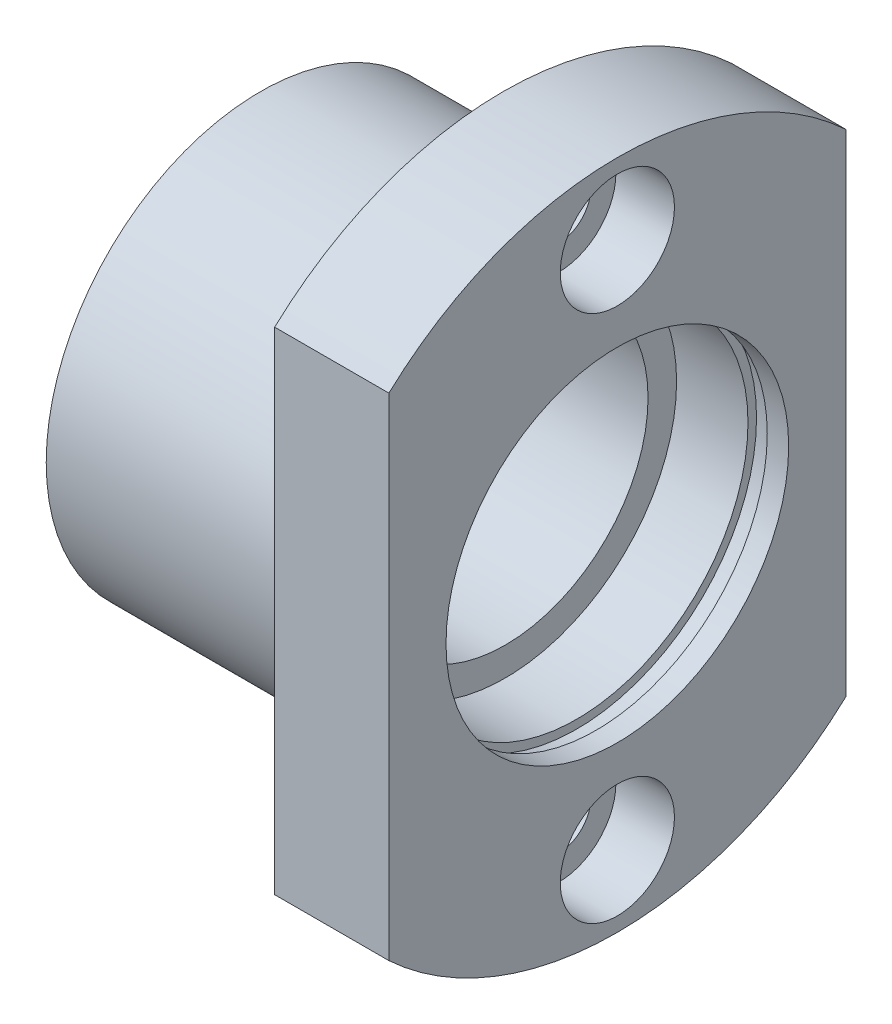
ISO-10303-21;
HEADER;
FILE_DESCRIPTION(('STEP AP214'),'2;1');
FILE_NAME('part.step','',(''),(''),'','','');
FILE_SCHEMA(('AUTOMOTIVE_DESIGN { 1 0 10303 214 1 1 1 1 }'));
ENDSEC;
DATA;
#1=APPLICATION_CONTEXT('core data for automotive mechanical design processes');
#2=APPLICATION_PROTOCOL_DEFINITION('international standard','automotive_design',2000,#1);
#3=PRODUCT_CONTEXT('',#1,'mechanical');
#4=PRODUCT('Part','Part','',(#3));
#5=PRODUCT_RELATED_PRODUCT_CATEGORY('part','',(#4));
#6=PRODUCT_DEFINITION_FORMATION('','',#4);
#7=PRODUCT_DEFINITION_CONTEXT('part definition',#1,'design');
#8=PRODUCT_DEFINITION('design','',#6,#7);
#9=PRODUCT_DEFINITION_SHAPE('','',#8);
#10=(LENGTH_UNIT() NAMED_UNIT(*) SI_UNIT(.MILLI.,.METRE.));
#11=(NAMED_UNIT(*) PLANE_ANGLE_UNIT() SI_UNIT($,.RADIAN.));
#12=(NAMED_UNIT(*) SI_UNIT($,.STERADIAN.) SOLID_ANGLE_UNIT());
#13=UNCERTAINTY_MEASURE_WITH_UNIT(LENGTH_MEASURE(1.E-05),#10,'distance_accuracy_value','');
#14=(GEOMETRIC_REPRESENTATION_CONTEXT(3) GLOBAL_UNCERTAINTY_ASSIGNED_CONTEXT((#13)) GLOBAL_UNIT_ASSIGNED_CONTEXT((#10,
#11,#12)) REPRESENTATION_CONTEXT('',''));
#15=CARTESIAN_POINT('',(0.,0.,0.));
#16=DIRECTION('',(0.,0.,1.));
#17=DIRECTION('',(1.,0.,0.));
#18=AXIS2_PLACEMENT_3D('',#15,#16,#17);
#19=CARTESIAN_POINT('',(17.,23.5,0.));
#20=DIRECTION('',(-1.,0.,0.));
#21=DIRECTION('',(0.,0.,1.));
#22=AXIS2_PLACEMENT_3D('',#19,#20,#21);
#23=PLANE('',#22);
#24=CARTESIAN_POINT('',(17.,18.5,0.));
#25=DIRECTION('',(-1.,0.,0.));
#26=DIRECTION('',(0.,0.,1.));
#27=AXIS2_PLACEMENT_3D('',#24,#25,#26);
#28=CIRCLE('',#27,2.25);
#29=CARTESIAN_POINT('',(17.,18.5,2.25));
#30=VERTEX_POINT('',#29);
#31=EDGE_CURVE('E37',#30,#30,#28,.T.);
#32=ORIENTED_EDGE('',*,*,#31,.F.);
#33=EDGE_LOOP('',(#32));
#34=FACE_BOUND('',#33,.T.);
#35=CARTESIAN_POINT('',(17.,-18.5,0.));
#36=DIRECTION('',(-1.,0.,0.));
#37=DIRECTION('',(0.,0.,1.));
#38=AXIS2_PLACEMENT_3D('',#35,#36,#37);
#39=CIRCLE('',#38,2.25);
#40=CARTESIAN_POINT('',(17.,-18.5,2.25));
#41=VERTEX_POINT('',#40);
#42=EDGE_CURVE('E109',#41,#41,#39,.T.);
#43=ORIENTED_EDGE('',*,*,#42,.F.);
#44=EDGE_LOOP('',(#43));
#45=FACE_BOUND('',#44,.T.);
#46=CARTESIAN_POINT('',(17.,0.,0.));
#47=DIRECTION('',(1.,0.,0.));
#48=DIRECTION('',(0.,0.,-1.));
#49=AXIS2_PLACEMENT_3D('',#46,#47,#48);
#50=CIRCLE('',#49,15.);
#51=CARTESIAN_POINT('',(17.,0.,-15.));
#52=VERTEX_POINT('',#51);
#53=EDGE_CURVE('E102',#52,#52,#50,.T.);
#54=ORIENTED_EDGE('',*,*,#53,.T.);
#55=EDGE_LOOP('',(#54));
#56=FACE_BOUND('',#55,.T.);
#57=CARTESIAN_POINT('',(17.,0.,0.));
#58=DIRECTION('',(1.,0.,0.));
#59=DIRECTION('',(0.,0.,-1.));
#60=AXIS2_PLACEMENT_3D('',#57,#58,#59);
#61=CIRCLE('',#60,23.5);
#62=CARTESIAN_POINT('',(17.,17.2119144780585,-16.));
#63=VERTEX_POINT('',#62);
#64=CARTESIAN_POINT('',(17.,17.2119144780585,16.));
#65=VERTEX_POINT('',#64);
#66=EDGE_CURVE('E94',#63,#65,#61,.T.);
#67=ORIENTED_EDGE('',*,*,#66,.F.);
#68=DIRECTION('',(0.,-1.,0.));
#69=VECTOR('',#68,1.);
#70=CARTESIAN_POINT('',(17.,17.2119144780585,-16.));
#71=LINE('',#70,#69);
#72=CARTESIAN_POINT('',(17.,-17.2119144780585,-16.));
#73=VERTEX_POINT('',#72);
#74=EDGE_CURVE('E82',#63,#73,#71,.T.);
#75=ORIENTED_EDGE('',*,*,#74,.T.);
#76=CARTESIAN_POINT('',(17.,-17.2119144780585,16.));
#77=VERTEX_POINT('',#76);
#78=EDGE_CURVE('E90',#77,#73,#61,.T.);
#79=ORIENTED_EDGE('',*,*,#78,.F.);
#80=DIRECTION('',(0.,1.,0.));
#81=VECTOR('',#80,1.);
#82=CARTESIAN_POINT('',(17.,17.2119144780585,16.));
#83=LINE('',#82,#81);
#84=EDGE_CURVE('E126',#77,#65,#83,.T.);
#85=ORIENTED_EDGE('',*,*,#84,.T.);
#86=EDGE_LOOP('',(#67,#75,#79,#85));
#87=FACE_BOUND('',#86,.T.);
#88=ADVANCED_FACE('F33',(#34,#45,#56,#87),#23,.T.);
#89=CARTESIAN_POINT('',(25.,0.,0.));
#90=DIRECTION('',(1.,0.,0.));
#91=DIRECTION('',(0.,0.,-1.));
#92=AXIS2_PLACEMENT_3D('',#89,#90,#91);
#93=CYLINDRICAL_SURFACE('',#92,23.5);
#94=CARTESIAN_POINT('',(25.,0.,0.));
#95=DIRECTION('',(1.,0.,0.));
#96=DIRECTION('',(0.,0.,-1.));
#97=AXIS2_PLACEMENT_3D('',#94,#95,#96);
#98=CIRCLE('',#97,23.5);
#99=CARTESIAN_POINT('',(25.,17.2119144780585,-16.));
#100=VERTEX_POINT('',#99);
#101=CARTESIAN_POINT('',(25.,17.2119144780585,16.));
#102=VERTEX_POINT('',#101);
#103=EDGE_CURVE('E95',#100,#102,#98,.T.);
#104=ORIENTED_EDGE('',*,*,#103,.F.);
#105=DIRECTION('',(-1.,0.,0.));
#106=VECTOR('',#105,1.);
#107=CARTESIAN_POINT('',(25.,17.2119144780585,-16.));
#108=LINE('',#107,#106);
#109=EDGE_CURVE('E50',#100,#63,#108,.T.);
#110=ORIENTED_EDGE('',*,*,#109,.T.);
#111=ORIENTED_EDGE('',*,*,#66,.T.);
#112=DIRECTION('',(-1.,0.,0.));
#113=VECTOR('',#112,1.);
#114=CARTESIAN_POINT('',(25.,17.2119144780585,16.));
#115=LINE('',#114,#113);
#116=EDGE_CURVE('E128',#102,#65,#115,.T.);
#117=ORIENTED_EDGE('',*,*,#116,.F.);
#118=EDGE_LOOP('',(#104,#110,#111,#117));
#119=FACE_BOUND('',#118,.T.);
#120=ADVANCED_FACE('F182',(#119),#93,.T.);
#121=ORIENTED_EDGE('',*,*,#78,.T.);
#122=DIRECTION('',(-1.,0.,0.));
#123=VECTOR('',#122,1.);
#124=CARTESIAN_POINT('',(25.,-17.2119144780585,-16.));
#125=LINE('',#124,#123);
#126=CARTESIAN_POINT('',(25.,-17.2119144780585,-16.));
#127=VERTEX_POINT('',#126);
#128=EDGE_CURVE('E77',#127,#73,#125,.T.);
#129=ORIENTED_EDGE('',*,*,#128,.F.);
#130=CARTESIAN_POINT('',(25.,-17.2119144780585,16.));
#131=VERTEX_POINT('',#130);
#132=EDGE_CURVE('E88',#131,#127,#98,.T.);
#133=ORIENTED_EDGE('',*,*,#132,.F.);
#134=DIRECTION('',(-1.,0.,0.));
#135=VECTOR('',#134,1.);
#136=CARTESIAN_POINT('',(25.,-17.2119144780585,16.));
#137=LINE('',#136,#135);
#138=EDGE_CURVE('E58',#131,#77,#137,.T.);
#139=ORIENTED_EDGE('',*,*,#138,.T.);
#140=EDGE_LOOP('',(#121,#129,#133,#139));
#141=FACE_BOUND('',#140,.T.);
#142=ADVANCED_FACE('F87',(#141),#93,.T.);
#143=CARTESIAN_POINT('',(25.,12.,0.));
#144=DIRECTION('',(1.,0.,0.));
#145=DIRECTION('',(0.,0.,-1.));
#146=AXIS2_PLACEMENT_3D('',#143,#144,#145);
#147=PLANE('',#146);
#148=CARTESIAN_POINT('',(25.,18.5,0.));
#149=DIRECTION('',(1.,0.,0.));
#150=DIRECTION('',(0.,0.,-1.));
#151=AXIS2_PLACEMENT_3D('',#148,#149,#150);
#152=CIRCLE('',#151,4.);
#153=CARTESIAN_POINT('',(25.,18.5,-4.));
#154=VERTEX_POINT('',#153);
#155=EDGE_CURVE('E408',#154,#154,#152,.T.);
#156=ORIENTED_EDGE('',*,*,#155,.F.);
#157=EDGE_LOOP('',(#156));
#158=FACE_BOUND('',#157,.T.);
#159=CARTESIAN_POINT('',(25.,-18.5,0.));
#160=DIRECTION('',(1.,0.,0.));
#161=DIRECTION('',(0.,0.,-1.));
#162=AXIS2_PLACEMENT_3D('',#159,#160,#161);
#163=CIRCLE('',#162,4.);
#164=CARTESIAN_POINT('',(25.,-18.5,-4.));
#165=VERTEX_POINT('',#164);
#166=EDGE_CURVE('E121',#165,#165,#163,.T.);
#167=ORIENTED_EDGE('',*,*,#166,.F.);
#168=EDGE_LOOP('',(#167));
#169=FACE_BOUND('',#168,.T.);
#170=CARTESIAN_POINT('',(25.,0.,0.));
#171=DIRECTION('',(1.,0.,0.));
#172=DIRECTION('',(0.,0.,-1.));
#173=AXIS2_PLACEMENT_3D('',#170,#171,#172);
#174=CIRCLE('',#173,12.);
#175=CARTESIAN_POINT('',(25.,0.,-12.));
#176=VERTEX_POINT('',#175);
#177=EDGE_CURVE('E98',#176,#176,#174,.T.);
#178=ORIENTED_EDGE('',*,*,#177,.F.);
#179=EDGE_LOOP('',(#178));
#180=FACE_BOUND('',#179,.T.);
#181=ORIENTED_EDGE('',*,*,#132,.T.);
#182=DIRECTION('',(0.,-1.,0.));
#183=VECTOR('',#182,1.);
#184=CARTESIAN_POINT('',(25.,17.2119144780585,-16.));
#185=LINE('',#184,#183);
#186=EDGE_CURVE('E74',#100,#127,#185,.T.);
#187=ORIENTED_EDGE('',*,*,#186,.F.);
#188=ORIENTED_EDGE('',*,*,#103,.T.);
#189=DIRECTION('',(0.,1.,0.));
#190=VECTOR('',#189,1.);
#191=CARTESIAN_POINT('',(25.,17.2119144780585,16.));
#192=LINE('',#191,#190);
#193=EDGE_CURVE('E93',#131,#102,#192,.T.);
#194=ORIENTED_EDGE('',*,*,#193,.F.);
#195=EDGE_LOOP('',(#181,#187,#188,#194));
#196=FACE_BOUND('',#195,.T.);
#197=ADVANCED_FACE('F92',(#158,#169,#180,#196),#147,.T.);
#198=CARTESIAN_POINT('',(1.5,12.,0.));
#199=DIRECTION('',(1.,0.,0.));
#200=DIRECTION('',(0.,0.,-1.));
#201=AXIS2_PLACEMENT_3D('',#198,#199,#200);
#202=PLANE('',#201);
#203=CARTESIAN_POINT('',(1.5,0.,0.));
#204=DIRECTION('',(1.,0.,0.));
#205=DIRECTION('',(0.,0.,-1.));
#206=AXIS2_PLACEMENT_3D('',#203,#204,#205);
#207=CIRCLE('',#206,12.6);
#208=CARTESIAN_POINT('',(1.5,0.,-12.6));
#209=VERTEX_POINT('',#208);
#210=EDGE_CURVE('E134',#209,#209,#207,.T.);
#211=ORIENTED_EDGE('',*,*,#210,.T.);
#212=EDGE_LOOP('',(#211));
#213=FACE_BOUND('',#212,.T.);
#214=CARTESIAN_POINT('',(1.5,0.,0.));
#215=DIRECTION('',(1.,0.,0.));
#216=DIRECTION('',(0.,0.,-1.));
#217=AXIS2_PLACEMENT_3D('',#214,#215,#216);
#218=CIRCLE('',#217,12.);
#219=CARTESIAN_POINT('',(1.5,0.,-12.));
#220=VERTEX_POINT('',#219);
#221=EDGE_CURVE('E11',#220,#220,#218,.T.);
#222=ORIENTED_EDGE('',*,*,#221,.F.);
#223=EDGE_LOOP('',(#222));
#224=FACE_BOUND('',#223,.T.);
#225=ADVANCED_FACE('F35',(#213,#224),#202,.T.);
#226=CARTESIAN_POINT('',(25.,0.,0.));
#227=DIRECTION('',(1.,0.,0.));
#228=DIRECTION('',(0.,0.,-1.));
#229=AXIS2_PLACEMENT_3D('',#226,#227,#228);
#230=CYLINDRICAL_SURFACE('',#229,12.);
#231=ORIENTED_EDGE('',*,*,#221,.T.);
#232=EDGE_LOOP('',(#231));
#233=FACE_BOUND('',#232,.T.);
#234=CARTESIAN_POINT('',(0.,0.,0.));
#235=DIRECTION('',(1.,0.,0.));
#236=DIRECTION('',(0.,0.,-1.));
#237=AXIS2_PLACEMENT_3D('',#234,#235,#236);
#238=CIRCLE('',#237,12.);
#239=CARTESIAN_POINT('',(0.,0.,-12.));
#240=VERTEX_POINT('',#239);
#241=EDGE_CURVE('E42',#240,#240,#238,.T.);
#242=ORIENTED_EDGE('',*,*,#241,.F.);
#243=EDGE_LOOP('',(#242));
#244=FACE_BOUND('',#243,.T.);
#245=ADVANCED_FACE('F180',(#233,#244),#230,.F.);
#246=CARTESIAN_POINT('',(0.,15.,0.));
#247=DIRECTION('',(-1.,0.,0.));
#248=DIRECTION('',(0.,0.,1.));
#249=AXIS2_PLACEMENT_3D('',#246,#247,#248);
#250=PLANE('',#249);
#251=ORIENTED_EDGE('',*,*,#241,.T.);
#252=EDGE_LOOP('',(#251));
#253=FACE_BOUND('',#252,.T.);
#254=CARTESIAN_POINT('',(0.,0.,0.));
#255=DIRECTION('',(1.,0.,0.));
#256=DIRECTION('',(0.,0.,-1.));
#257=AXIS2_PLACEMENT_3D('',#254,#255,#256);
#258=CIRCLE('',#257,15.);
#259=CARTESIAN_POINT('',(0.,0.,-15.));
#260=VERTEX_POINT('',#259);
#261=EDGE_CURVE('E105',#260,#260,#258,.T.);
#262=ORIENTED_EDGE('',*,*,#261,.F.);
#263=EDGE_LOOP('',(#262));
#264=FACE_BOUND('',#263,.T.);
#265=ADVANCED_FACE('F200',(#253,#264),#250,.T.);
#266=CARTESIAN_POINT('',(25.,0.,0.));
#267=DIRECTION('',(1.,0.,0.));
#268=DIRECTION('',(0.,0.,-1.));
#269=AXIS2_PLACEMENT_3D('',#266,#267,#268);
#270=CYLINDRICAL_SURFACE('',#269,15.);
#271=ORIENTED_EDGE('',*,*,#261,.T.);
#272=EDGE_LOOP('',(#271));
#273=FACE_BOUND('',#272,.T.);
#274=ORIENTED_EDGE('',*,*,#53,.F.);
#275=EDGE_LOOP('',(#274));
#276=FACE_BOUND('',#275,.T.);
#277=ADVANCED_FACE('F197',(#273,#276),#270,.T.);
#278=CARTESIAN_POINT('',(25.,0.,0.));
#279=DIRECTION('',(1.,0.,0.));
#280=DIRECTION('',(0.,0.,-1.));
#281=AXIS2_PLACEMENT_3D('',#278,#279,#280);
#282=CYLINDRICAL_SURFACE('',#281,12.);
#283=ORIENTED_EDGE('',*,*,#177,.T.);
#284=EDGE_LOOP('',(#283));
#285=FACE_BOUND('',#284,.T.);
#286=CARTESIAN_POINT('',(23.5,0.,0.));
#287=DIRECTION('',(1.,0.,0.));
#288=DIRECTION('',(0.,0.,-1.));
#289=AXIS2_PLACEMENT_3D('',#286,#287,#288);
#290=CIRCLE('',#289,12.);
#291=CARTESIAN_POINT('',(23.5,0.,-12.));
#292=VERTEX_POINT('',#291);
#293=EDGE_CURVE('E163',#292,#292,#290,.T.);
#294=ORIENTED_EDGE('',*,*,#293,.F.);
#295=EDGE_LOOP('',(#294));
#296=FACE_BOUND('',#295,.T.);
#297=ADVANCED_FACE('F170',(#285,#296),#282,.F.);
#298=CARTESIAN_POINT('',(23.5,12.6,0.));
#299=DIRECTION('',(-1.,0.,0.));
#300=DIRECTION('',(0.,0.,1.));
#301=AXIS2_PLACEMENT_3D('',#298,#299,#300);
#302=PLANE('',#301);
#303=ORIENTED_EDGE('',*,*,#293,.T.);
#304=EDGE_LOOP('',(#303));
#305=FACE_BOUND('',#304,.T.);
#306=CARTESIAN_POINT('',(23.5,0.,0.));
#307=DIRECTION('',(1.,0.,0.));
#308=DIRECTION('',(0.,0.,-1.));
#309=AXIS2_PLACEMENT_3D('',#306,#307,#308);
#310=CIRCLE('',#309,12.6);
#311=CARTESIAN_POINT('',(23.5,0.,-12.6));
#312=VERTEX_POINT('',#311);
#313=EDGE_CURVE('E161',#312,#312,#310,.T.);
#314=ORIENTED_EDGE('',*,*,#313,.F.);
#315=EDGE_LOOP('',(#314));
#316=FACE_BOUND('',#315,.T.);
#317=ADVANCED_FACE('F264',(#305,#316),#302,.T.);
#318=CARTESIAN_POINT('',(25.,0.,0.));
#319=DIRECTION('',(1.,0.,0.));
#320=DIRECTION('',(0.,0.,-1.));
#321=AXIS2_PLACEMENT_3D('',#318,#319,#320);
#322=CYLINDRICAL_SURFACE('',#321,12.6);
#323=ORIENTED_EDGE('',*,*,#313,.T.);
#324=EDGE_LOOP('',(#323));
#325=FACE_BOUND('',#324,.T.);
#326=CARTESIAN_POINT('',(22.15,0.,0.));
#327=DIRECTION('',(1.,0.,0.));
#328=DIRECTION('',(0.,0.,-1.));
#329=AXIS2_PLACEMENT_3D('',#326,#327,#328);
#330=CIRCLE('',#329,12.6);
#331=CARTESIAN_POINT('',(22.15,0.,-12.6));
#332=VERTEX_POINT('',#331);
#333=EDGE_CURVE('E158',#332,#332,#330,.T.);
#334=ORIENTED_EDGE('',*,*,#333,.F.);
#335=EDGE_LOOP('',(#334));
#336=FACE_BOUND('',#335,.T.);
#337=ADVANCED_FACE('F260',(#325,#336),#322,.F.);
#338=CARTESIAN_POINT('',(22.15,12.,0.));
#339=DIRECTION('',(1.,0.,0.));
#340=DIRECTION('',(0.,0.,-1.));
#341=AXIS2_PLACEMENT_3D('',#338,#339,#340);
#342=PLANE('',#341);
#343=ORIENTED_EDGE('',*,*,#333,.T.);
#344=EDGE_LOOP('',(#343));
#345=FACE_BOUND('',#344,.T.);
#346=CARTESIAN_POINT('',(22.15,0.,0.));
#347=DIRECTION('',(1.,0.,0.));
#348=DIRECTION('',(0.,0.,-1.));
#349=AXIS2_PLACEMENT_3D('',#346,#347,#348);
#350=CIRCLE('',#349,12.);
#351=CARTESIAN_POINT('',(22.15,0.,-12.));
#352=VERTEX_POINT('',#351);
#353=EDGE_CURVE('E155',#352,#352,#350,.T.);
#354=ORIENTED_EDGE('',*,*,#353,.F.);
#355=EDGE_LOOP('',(#354));
#356=FACE_BOUND('',#355,.T.);
#357=ADVANCED_FACE('F256',(#345,#356),#342,.T.);
#358=CARTESIAN_POINT('',(25.,0.,0.));
#359=DIRECTION('',(1.,0.,0.));
#360=DIRECTION('',(0.,0.,-1.));
#361=AXIS2_PLACEMENT_3D('',#358,#359,#360);
#362=CYLINDRICAL_SURFACE('',#361,12.);
#363=ORIENTED_EDGE('',*,*,#353,.T.);
#364=EDGE_LOOP('',(#363));
#365=FACE_BOUND('',#364,.T.);
#366=CARTESIAN_POINT('',(17.15,0.,0.));
#367=DIRECTION('',(1.,0.,0.));
#368=DIRECTION('',(0.,0.,-1.));
#369=AXIS2_PLACEMENT_3D('',#366,#367,#368);
#370=CIRCLE('',#369,12.);
#371=CARTESIAN_POINT('',(17.15,0.,-12.));
#372=VERTEX_POINT('',#371);
#373=EDGE_CURVE('E152',#372,#372,#370,.T.);
#374=ORIENTED_EDGE('',*,*,#373,.F.);
#375=EDGE_LOOP('',(#374));
#376=FACE_BOUND('',#375,.T.);
#377=ADVANCED_FACE('F252',(#365,#376),#362,.F.);
#378=CARTESIAN_POINT('',(17.15,10.,0.));
#379=DIRECTION('',(1.,0.,0.));
#380=DIRECTION('',(0.,0.,-1.));
#381=AXIS2_PLACEMENT_3D('',#378,#379,#380);
#382=PLANE('',#381);
#383=ORIENTED_EDGE('',*,*,#373,.T.);
#384=EDGE_LOOP('',(#383));
#385=FACE_BOUND('',#384,.T.);
#386=CARTESIAN_POINT('',(17.15,0.,0.));
#387=DIRECTION('',(1.,0.,0.));
#388=DIRECTION('',(0.,0.,-1.));
#389=AXIS2_PLACEMENT_3D('',#386,#387,#388);
#390=CIRCLE('',#389,10.);
#391=CARTESIAN_POINT('',(17.15,0.,-10.));
#392=VERTEX_POINT('',#391);
#393=EDGE_CURVE('E149',#392,#392,#390,.T.);
#394=ORIENTED_EDGE('',*,*,#393,.F.);
#395=EDGE_LOOP('',(#394));
#396=FACE_BOUND('',#395,.T.);
#397=ADVANCED_FACE('F248',(#385,#396),#382,.T.);
#398=CARTESIAN_POINT('',(25.,0.,0.));
#399=DIRECTION('',(1.,0.,0.));
#400=DIRECTION('',(0.,0.,-1.));
#401=AXIS2_PLACEMENT_3D('',#398,#399,#400);
#402=CYLINDRICAL_SURFACE('',#401,10.);
#403=ORIENTED_EDGE('',*,*,#393,.T.);
#404=EDGE_LOOP('',(#403));
#405=FACE_BOUND('',#404,.T.);
#406=CARTESIAN_POINT('',(7.85,0.,0.));
#407=DIRECTION('',(1.,0.,0.));
#408=DIRECTION('',(0.,0.,-1.));
#409=AXIS2_PLACEMENT_3D('',#406,#407,#408);
#410=CIRCLE('',#409,10.);
#411=CARTESIAN_POINT('',(7.85,0.,-10.));
#412=VERTEX_POINT('',#411);
#413=EDGE_CURVE('E146',#412,#412,#410,.T.);
#414=ORIENTED_EDGE('',*,*,#413,.F.);
#415=EDGE_LOOP('',(#414));
#416=FACE_BOUND('',#415,.T.);
#417=ADVANCED_FACE('F244',(#405,#416),#402,.F.);
#418=CARTESIAN_POINT('',(7.85,12.,0.));
#419=DIRECTION('',(-1.,0.,0.));
#420=DIRECTION('',(0.,0.,1.));
#421=AXIS2_PLACEMENT_3D('',#418,#419,#420);
#422=PLANE('',#421);
#423=ORIENTED_EDGE('',*,*,#413,.T.);
#424=EDGE_LOOP('',(#423));
#425=FACE_BOUND('',#424,.T.);
#426=CARTESIAN_POINT('',(7.85,0.,0.));
#427=DIRECTION('',(1.,0.,0.));
#428=DIRECTION('',(0.,0.,-1.));
#429=AXIS2_PLACEMENT_3D('',#426,#427,#428);
#430=CIRCLE('',#429,12.);
#431=CARTESIAN_POINT('',(7.85,0.,-12.));
#432=VERTEX_POINT('',#431);
#433=EDGE_CURVE('E143',#432,#432,#430,.T.);
#434=ORIENTED_EDGE('',*,*,#433,.F.);
#435=EDGE_LOOP('',(#434));
#436=FACE_BOUND('',#435,.T.);
#437=ADVANCED_FACE('F240',(#425,#436),#422,.T.);
#438=CARTESIAN_POINT('',(25.,0.,0.));
#439=DIRECTION('',(1.,0.,0.));
#440=DIRECTION('',(0.,0.,-1.));
#441=AXIS2_PLACEMENT_3D('',#438,#439,#440);
#442=CYLINDRICAL_SURFACE('',#441,12.);
#443=ORIENTED_EDGE('',*,*,#433,.T.);
#444=EDGE_LOOP('',(#443));
#445=FACE_BOUND('',#444,.T.);
#446=CARTESIAN_POINT('',(2.85,0.,0.));
#447=DIRECTION('',(1.,0.,0.));
#448=DIRECTION('',(0.,0.,-1.));
#449=AXIS2_PLACEMENT_3D('',#446,#447,#448);
#450=CIRCLE('',#449,12.);
#451=CARTESIAN_POINT('',(2.85,0.,-12.));
#452=VERTEX_POINT('',#451);
#453=EDGE_CURVE('E140',#452,#452,#450,.T.);
#454=ORIENTED_EDGE('',*,*,#453,.F.);
#455=EDGE_LOOP('',(#454));
#456=FACE_BOUND('',#455,.T.);
#457=ADVANCED_FACE('F236',(#445,#456),#442,.F.);
#458=CARTESIAN_POINT('',(2.85,12.6,0.));
#459=DIRECTION('',(-1.,0.,0.));
#460=DIRECTION('',(0.,0.,1.));
#461=AXIS2_PLACEMENT_3D('',#458,#459,#460);
#462=PLANE('',#461);
#463=ORIENTED_EDGE('',*,*,#453,.T.);
#464=EDGE_LOOP('',(#463));
#465=FACE_BOUND('',#464,.T.);
#466=CARTESIAN_POINT('',(2.85,0.,0.));
#467=DIRECTION('',(1.,0.,0.));
#468=DIRECTION('',(0.,0.,-1.));
#469=AXIS2_PLACEMENT_3D('',#466,#467,#468);
#470=CIRCLE('',#469,12.6);
#471=CARTESIAN_POINT('',(2.85,0.,-12.6));
#472=VERTEX_POINT('',#471);
#473=EDGE_CURVE('E137',#472,#472,#470,.T.);
#474=ORIENTED_EDGE('',*,*,#473,.F.);
#475=EDGE_LOOP('',(#474));
#476=FACE_BOUND('',#475,.T.);
#477=ADVANCED_FACE('F229',(#465,#476),#462,.T.);
#478=CARTESIAN_POINT('',(25.,0.,0.));
#479=DIRECTION('',(1.,0.,0.));
#480=DIRECTION('',(0.,0.,-1.));
#481=AXIS2_PLACEMENT_3D('',#478,#479,#480);
#482=CYLINDRICAL_SURFACE('',#481,12.6);
#483=ORIENTED_EDGE('',*,*,#473,.T.);
#484=EDGE_LOOP('',(#483));
#485=FACE_BOUND('',#484,.T.);
#486=ORIENTED_EDGE('',*,*,#210,.F.);
#487=EDGE_LOOP('',(#486));
#488=FACE_BOUND('',#487,.T.);
#489=ADVANCED_FACE('F221',(#485,#488),#482,.F.);
#490=CARTESIAN_POINT('',(25.,17.2119144780585,16.));
#491=DIRECTION('',(0.,0.,1.));
#492=DIRECTION('',(1.,0.,0.));
#493=AXIS2_PLACEMENT_3D('',#490,#491,#492);
#494=PLANE('',#493);
#495=ORIENTED_EDGE('',*,*,#84,.F.);
#496=ORIENTED_EDGE('',*,*,#138,.F.);
#497=ORIENTED_EDGE('',*,*,#193,.T.);
#498=ORIENTED_EDGE('',*,*,#116,.T.);
#499=EDGE_LOOP('',(#495,#496,#497,#498));
#500=FACE_BOUND('',#499,.T.);
#501=ADVANCED_FACE('F219',(#500),#494,.T.);
#502=CARTESIAN_POINT('',(25.,17.2119144780585,-16.));
#503=DIRECTION('',(0.,0.,-1.));
#504=DIRECTION('',(-1.,0.,0.));
#505=AXIS2_PLACEMENT_3D('',#502,#503,#504);
#506=PLANE('',#505);
#507=ORIENTED_EDGE('',*,*,#74,.F.);
#508=ORIENTED_EDGE('',*,*,#109,.F.);
#509=ORIENTED_EDGE('',*,*,#186,.T.);
#510=ORIENTED_EDGE('',*,*,#128,.T.);
#511=EDGE_LOOP('',(#507,#508,#509,#510));
#512=FACE_BOUND('',#511,.T.);
#513=ADVANCED_FACE('F76',(#512),#506,.T.);
#514=CARTESIAN_POINT('',(25.,-18.5,0.));
#515=DIRECTION('',(1.,0.,0.));
#516=DIRECTION('',(0.,0.,-1.));
#517=AXIS2_PLACEMENT_3D('',#514,#515,#516);
#518=CYLINDRICAL_SURFACE('',#517,2.25);
#519=ORIENTED_EDGE('',*,*,#42,.T.);
#520=EDGE_LOOP('',(#519));
#521=FACE_BOUND('',#520,.T.);
#522=CARTESIAN_POINT('',(20.9,-18.5,0.));
#523=DIRECTION('',(1.,0.,0.));
#524=DIRECTION('',(0.,0.,-1.));
#525=AXIS2_PLACEMENT_3D('',#522,#523,#524);
#526=CIRCLE('',#525,2.25);
#527=CARTESIAN_POINT('',(20.9,-18.5,-2.25));
#528=VERTEX_POINT('',#527);
#529=EDGE_CURVE('E111',#528,#528,#526,.T.);
#530=ORIENTED_EDGE('',*,*,#529,.T.);
#531=EDGE_LOOP('',(#530));
#532=FACE_BOUND('',#531,.T.);
#533=ADVANCED_FACE('F227',(#521,#532),#518,.F.);
#534=CARTESIAN_POINT('',(20.9,-16.25,0.));
#535=DIRECTION('',(-1.,0.,0.));
#536=DIRECTION('',(0.,0.,1.));
#537=AXIS2_PLACEMENT_3D('',#534,#535,#536);
#538=PLANE('',#537);
#539=ORIENTED_EDGE('',*,*,#529,.F.);
#540=EDGE_LOOP('',(#539));
#541=FACE_BOUND('',#540,.T.);
#542=CARTESIAN_POINT('',(20.9,-18.5,0.));
#543=DIRECTION('',(1.,0.,0.));
#544=DIRECTION('',(0.,0.,-1.));
#545=AXIS2_PLACEMENT_3D('',#542,#543,#544);
#546=CIRCLE('',#545,4.);
#547=CARTESIAN_POINT('',(20.9,-18.5,-4.));
#548=VERTEX_POINT('',#547);
#549=EDGE_CURVE('E116',#548,#548,#546,.T.);
#550=ORIENTED_EDGE('',*,*,#549,.T.);
#551=EDGE_LOOP('',(#550));
#552=FACE_BOUND('',#551,.T.);
#553=ADVANCED_FACE('F351',(#541,#552),#538,.F.);
#554=CARTESIAN_POINT('',(25.,-18.5,0.));
#555=DIRECTION('',(1.,0.,0.));
#556=DIRECTION('',(0.,0.,-1.));
#557=AXIS2_PLACEMENT_3D('',#554,#555,#556);
#558=CYLINDRICAL_SURFACE('',#557,4.);
#559=ORIENTED_EDGE('',*,*,#549,.F.);
#560=EDGE_LOOP('',(#559));
#561=FACE_BOUND('',#560,.T.);
#562=ORIENTED_EDGE('',*,*,#166,.T.);
#563=EDGE_LOOP('',(#562));
#564=FACE_BOUND('',#563,.T.);
#565=ADVANCED_FACE('F359',(#561,#564),#558,.F.);
#566=CARTESIAN_POINT('',(25.,18.5,0.));
#567=DIRECTION('',(1.,0.,0.));
#568=DIRECTION('',(0.,0.,-1.));
#569=AXIS2_PLACEMENT_3D('',#566,#567,#568);
#570=CYLINDRICAL_SURFACE('',#569,2.25);
#571=ORIENTED_EDGE('',*,*,#31,.T.);
#572=EDGE_LOOP('',(#571));
#573=FACE_BOUND('',#572,.T.);
#574=CARTESIAN_POINT('',(20.9,18.5,0.));
#575=DIRECTION('',(1.,0.,0.));
#576=DIRECTION('',(0.,0.,-1.));
#577=AXIS2_PLACEMENT_3D('',#574,#575,#576);
#578=CIRCLE('',#577,2.25);
#579=CARTESIAN_POINT('',(20.9,18.5,-2.25));
#580=VERTEX_POINT('',#579);
#581=EDGE_CURVE('E410',#580,#580,#578,.T.);
#582=ORIENTED_EDGE('',*,*,#581,.T.);
#583=EDGE_LOOP('',(#582));
#584=FACE_BOUND('',#583,.T.);
#585=ADVANCED_FACE('F369',(#573,#584),#570,.F.);
#586=CARTESIAN_POINT('',(20.9,20.75,0.));
#587=DIRECTION('',(-1.,0.,0.));
#588=DIRECTION('',(0.,0.,1.));
#589=AXIS2_PLACEMENT_3D('',#586,#587,#588);
#590=PLANE('',#589);
#591=ORIENTED_EDGE('',*,*,#581,.F.);
#592=EDGE_LOOP('',(#591));
#593=FACE_BOUND('',#592,.T.);
#594=CARTESIAN_POINT('',(20.9,18.5,0.));
#595=DIRECTION('',(1.,0.,0.));
#596=DIRECTION('',(0.,0.,-1.));
#597=AXIS2_PLACEMENT_3D('',#594,#595,#596);
#598=CIRCLE('',#597,4.);
#599=CARTESIAN_POINT('',(20.9,18.5,-4.));
#600=VERTEX_POINT('',#599);
#601=EDGE_CURVE('E406',#600,#600,#598,.T.);
#602=ORIENTED_EDGE('',*,*,#601,.T.);
#603=EDGE_LOOP('',(#602));
#604=FACE_BOUND('',#603,.T.);
#605=ADVANCED_FACE('F379',(#593,#604),#590,.F.);
#606=CARTESIAN_POINT('',(25.,18.5,0.));
#607=DIRECTION('',(1.,0.,0.));
#608=DIRECTION('',(0.,0.,-1.));
#609=AXIS2_PLACEMENT_3D('',#606,#607,#608);
#610=CYLINDRICAL_SURFACE('',#609,4.);
#611=ORIENTED_EDGE('',*,*,#601,.F.);
#612=EDGE_LOOP('',(#611));
#613=FACE_BOUND('',#612,.T.);
#614=ORIENTED_EDGE('',*,*,#155,.T.);
#615=EDGE_LOOP('',(#614));
#616=FACE_BOUND('',#615,.T.);
#617=ADVANCED_FACE('F389',(#613,#616),#610,.F.);
#618=CLOSED_SHELL('',(#88,#120,#142,#197,#225,#245,#265,#277,#297,#317,#337,#357,#377,#397,#417,
#437,#457,#477,#489,#501,#513,#533,#553,#565,#585,#605,#617));
#619=MANIFOLD_SOLID_BREP('B2',#618);
#620=ADVANCED_BREP_SHAPE_REPRESENTATION('',(#18,#619),#14);
#621=SHAPE_DEFINITION_REPRESENTATION(#9,#620);
ENDSEC;
END-ISO-10303-21;
